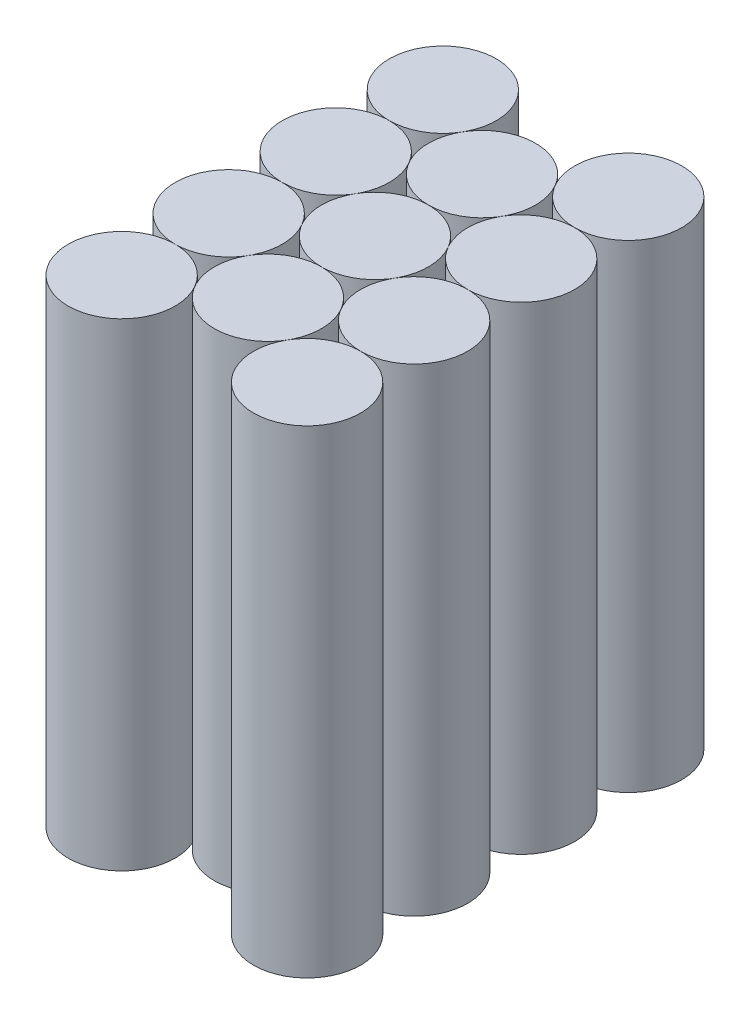
ISO-10303-21;
HEADER;
FILE_DESCRIPTION(('STEP AP214'),'2;1');
FILE_NAME('part.step','',(''),(''),'','','');
FILE_SCHEMA(('AUTOMOTIVE_DESIGN { 1 0 10303 214 1 1 1 1 }'));
ENDSEC;
DATA;
#1=APPLICATION_CONTEXT('core data for automotive mechanical design processes');
#2=APPLICATION_PROTOCOL_DEFINITION('international standard','automotive_design',2000,#1);
#3=PRODUCT_CONTEXT('',#1,'mechanical');
#4=PRODUCT('Part','Part','',(#3));
#5=PRODUCT_RELATED_PRODUCT_CATEGORY('part','',(#4));
#6=PRODUCT_DEFINITION_FORMATION('','',#4);
#7=PRODUCT_DEFINITION_CONTEXT('part definition',#1,'design');
#8=PRODUCT_DEFINITION('design','',#6,#7);
#9=PRODUCT_DEFINITION_SHAPE('','',#8);
#10=(LENGTH_UNIT() NAMED_UNIT(*) SI_UNIT(.MILLI.,.METRE.));
#11=(NAMED_UNIT(*) PLANE_ANGLE_UNIT() SI_UNIT($,.RADIAN.));
#12=(NAMED_UNIT(*) SI_UNIT($,.STERADIAN.) SOLID_ANGLE_UNIT());
#13=UNCERTAINTY_MEASURE_WITH_UNIT(LENGTH_MEASURE(1.E-05),#10,'distance_accuracy_value','');
#14=(GEOMETRIC_REPRESENTATION_CONTEXT(3) GLOBAL_UNCERTAINTY_ASSIGNED_CONTEXT((#13)) GLOBAL_UNIT_ASSIGNED_CONTEXT((#10,
#11,#12)) REPRESENTATION_CONTEXT('',''));
#15=CARTESIAN_POINT('',(0.,0.,0.));
#16=DIRECTION('',(0.,0.,1.));
#17=DIRECTION('',(1.,0.,0.));
#18=AXIS2_PLACEMENT_3D('',#15,#16,#17);
#19=CARTESIAN_POINT('',(12.9903810567666,67.,-22.5));
#20=DIRECTION('',(0.,-1.,0.));
#21=DIRECTION('',(0.,0.,-1.));
#22=AXIS2_PLACEMENT_3D('',#19,#20,#21);
#23=CYLINDRICAL_SURFACE('',#22,7.49999999999999);
#24=CARTESIAN_POINT('',(12.9903810567666,67.,-22.5));
#25=DIRECTION('',(0.,1.,0.));
#26=DIRECTION('',(0.,0.,1.));
#27=AXIS2_PLACEMENT_3D('',#24,#25,#26);
#28=CIRCLE('',#27,7.49999999999999);
#29=CARTESIAN_POINT('',(12.9903810567666,67.,-15.));
#30=VERTEX_POINT('',#29);
#31=EDGE_CURVE('E12',#30,#30,#28,.T.);
#32=ORIENTED_EDGE('',*,*,#31,.F.);
#33=EDGE_LOOP('',(#32));
#34=FACE_BOUND('',#33,.T.);
#35=CARTESIAN_POINT('',(12.9903810567666,0.,-22.5));
#36=DIRECTION('',(0.,1.,0.));
#37=DIRECTION('',(0.,0.,1.));
#38=AXIS2_PLACEMENT_3D('',#35,#36,#37);
#39=CIRCLE('',#38,7.49999999999999);
#40=CARTESIAN_POINT('',(12.9903810567666,0.,-15.));
#41=VERTEX_POINT('',#40);
#42=EDGE_CURVE('E125',#41,#41,#39,.T.);
#43=ORIENTED_EDGE('',*,*,#42,.T.);
#44=EDGE_LOOP('',(#43));
#45=FACE_BOUND('',#44,.T.);
#46=ADVANCED_FACE('F122',(#34,#45),#23,.T.);
#47=CARTESIAN_POINT('',(0.,67.,0.));
#48=DIRECTION('',(0.,1.,0.));
#49=DIRECTION('',(0.,0.,1.));
#50=AXIS2_PLACEMENT_3D('',#47,#48,#49);
#51=PLANE('',#50);
#52=ORIENTED_EDGE('',*,*,#31,.T.);
#53=EDGE_LOOP('',(#52));
#54=FACE_BOUND('',#53,.T.);
#55=ADVANCED_FACE('F137',(#54),#51,.T.);
#56=CARTESIAN_POINT('',(0.,0.,0.));
#57=DIRECTION('',(0.,1.,0.));
#58=DIRECTION('',(0.,0.,1.));
#59=AXIS2_PLACEMENT_3D('',#56,#57,#58);
#60=PLANE('',#59);
#61=ORIENTED_EDGE('',*,*,#42,.F.);
#62=EDGE_LOOP('',(#61));
#63=FACE_BOUND('',#62,.T.);
#64=ADVANCED_FACE('F135',(#63),#60,.F.);
#65=CLOSED_SHELL('',(#46,#55,#64));
#66=MANIFOLD_SOLID_BREP('B2',#65);
#67=CARTESIAN_POINT('',(12.9903810567666,67.,-37.5));
#68=DIRECTION('',(0.,-1.,0.));
#69=DIRECTION('',(0.,0.,-1.));
#70=AXIS2_PLACEMENT_3D('',#67,#68,#69);
#71=CYLINDRICAL_SURFACE('',#70,7.5);
#72=CARTESIAN_POINT('',(12.9903810567666,67.,-37.5));
#73=DIRECTION('',(0.,1.,0.));
#74=DIRECTION('',(0.,0.,1.));
#75=AXIS2_PLACEMENT_3D('',#72,#73,#74);
#76=CIRCLE('',#75,7.5);
#77=CARTESIAN_POINT('',(12.9903810567666,67.,-30.));
#78=VERTEX_POINT('',#77);
#79=EDGE_CURVE('E121',#78,#78,#76,.T.);
#80=ORIENTED_EDGE('',*,*,#79,.F.);
#81=EDGE_LOOP('',(#80));
#82=FACE_BOUND('',#81,.T.);
#83=CARTESIAN_POINT('',(12.9903810567666,0.,-37.5));
#84=DIRECTION('',(0.,1.,0.));
#85=DIRECTION('',(0.,0.,1.));
#86=AXIS2_PLACEMENT_3D('',#83,#84,#85);
#87=CIRCLE('',#86,7.5);
#88=CARTESIAN_POINT('',(12.9903810567666,0.,-30.));
#89=VERTEX_POINT('',#88);
#90=EDGE_CURVE('E174',#89,#89,#87,.T.);
#91=ORIENTED_EDGE('',*,*,#90,.T.);
#92=EDGE_LOOP('',(#91));
#93=FACE_BOUND('',#92,.T.);
#94=ADVANCED_FACE('F171',(#82,#93),#71,.T.);
#95=CARTESIAN_POINT('',(0.,67.,0.));
#96=DIRECTION('',(0.,1.,0.));
#97=DIRECTION('',(0.,0.,1.));
#98=AXIS2_PLACEMENT_3D('',#95,#96,#97);
#99=PLANE('',#98);
#100=ORIENTED_EDGE('',*,*,#79,.T.);
#101=EDGE_LOOP('',(#100));
#102=FACE_BOUND('',#101,.T.);
#103=ADVANCED_FACE('F186',(#102),#99,.T.);
#104=CARTESIAN_POINT('',(0.,0.,0.));
#105=DIRECTION('',(0.,1.,0.));
#106=DIRECTION('',(0.,0.,1.));
#107=AXIS2_PLACEMENT_3D('',#104,#105,#106);
#108=PLANE('',#107);
#109=ORIENTED_EDGE('',*,*,#90,.F.);
#110=EDGE_LOOP('',(#109));
#111=FACE_BOUND('',#110,.T.);
#112=ADVANCED_FACE('F184',(#111),#108,.F.);
#113=CLOSED_SHELL('',(#94,#103,#112));
#114=MANIFOLD_SOLID_BREP('B7',#113);
#115=CARTESIAN_POINT('',(12.9903810567666,67.,-52.5));
#116=DIRECTION('',(0.,-1.,0.));
#117=DIRECTION('',(0.,0.,-1.));
#118=AXIS2_PLACEMENT_3D('',#115,#116,#117);
#119=CYLINDRICAL_SURFACE('',#118,7.49999999999999);
#120=CARTESIAN_POINT('',(12.9903810567666,67.,-52.5));
#121=DIRECTION('',(0.,1.,0.));
#122=DIRECTION('',(0.,0.,1.));
#123=AXIS2_PLACEMENT_3D('',#120,#121,#122);
#124=CIRCLE('',#123,7.49999999999999);
#125=CARTESIAN_POINT('',(12.9903810567666,67.,-45.));
#126=VERTEX_POINT('',#125);
#127=EDGE_CURVE('E170',#126,#126,#124,.T.);
#128=ORIENTED_EDGE('',*,*,#127,.F.);
#129=EDGE_LOOP('',(#128));
#130=FACE_BOUND('',#129,.T.);
#131=CARTESIAN_POINT('',(12.9903810567666,0.,-52.5));
#132=DIRECTION('',(0.,1.,0.));
#133=DIRECTION('',(0.,0.,1.));
#134=AXIS2_PLACEMENT_3D('',#131,#132,#133);
#135=CIRCLE('',#134,7.49999999999999);
#136=CARTESIAN_POINT('',(12.9903810567666,0.,-45.));
#137=VERTEX_POINT('',#136);
#138=EDGE_CURVE('E223',#137,#137,#135,.T.);
#139=ORIENTED_EDGE('',*,*,#138,.T.);
#140=EDGE_LOOP('',(#139));
#141=FACE_BOUND('',#140,.T.);
#142=ADVANCED_FACE('F220',(#130,#141),#119,.T.);
#143=CARTESIAN_POINT('',(0.,67.,0.));
#144=DIRECTION('',(0.,1.,0.));
#145=DIRECTION('',(0.,0.,1.));
#146=AXIS2_PLACEMENT_3D('',#143,#144,#145);
#147=PLANE('',#146);
#148=ORIENTED_EDGE('',*,*,#127,.T.);
#149=EDGE_LOOP('',(#148));
#150=FACE_BOUND('',#149,.T.);
#151=ADVANCED_FACE('F235',(#150),#147,.T.);
#152=CARTESIAN_POINT('',(0.,0.,0.));
#153=DIRECTION('',(0.,1.,0.));
#154=DIRECTION('',(0.,0.,1.));
#155=AXIS2_PLACEMENT_3D('',#152,#153,#154);
#156=PLANE('',#155);
#157=ORIENTED_EDGE('',*,*,#138,.F.);
#158=EDGE_LOOP('',(#157));
#159=FACE_BOUND('',#158,.T.);
#160=ADVANCED_FACE('F233',(#159),#156,.F.);
#161=CLOSED_SHELL('',(#142,#151,#160));
#162=MANIFOLD_SOLID_BREP('B116',#161);
#163=CARTESIAN_POINT('',(0.,67.,-30.));
#164=DIRECTION('',(0.,-1.,0.));
#165=DIRECTION('',(0.,0.,-1.));
#166=AXIS2_PLACEMENT_3D('',#163,#164,#165);
#167=CYLINDRICAL_SURFACE('',#166,7.5);
#168=CARTESIAN_POINT('',(0.,67.,-30.));
#169=DIRECTION('',(0.,1.,0.));
#170=DIRECTION('',(0.,0.,1.));
#171=AXIS2_PLACEMENT_3D('',#168,#169,#170);
#172=CIRCLE('',#171,7.5);
#173=CARTESIAN_POINT('',(0.,67.,-22.5));
#174=VERTEX_POINT('',#173);
#175=EDGE_CURVE('E219',#174,#174,#172,.T.);
#176=ORIENTED_EDGE('',*,*,#175,.F.);
#177=EDGE_LOOP('',(#176));
#178=FACE_BOUND('',#177,.T.);
#179=CARTESIAN_POINT('',(0.,0.,-30.));
#180=DIRECTION('',(0.,1.,0.));
#181=DIRECTION('',(0.,0.,1.));
#182=AXIS2_PLACEMENT_3D('',#179,#180,#181);
#183=CIRCLE('',#182,7.5);
#184=CARTESIAN_POINT('',(0.,0.,-22.5));
#185=VERTEX_POINT('',#184);
#186=EDGE_CURVE('E272',#185,#185,#183,.T.);
#187=ORIENTED_EDGE('',*,*,#186,.T.);
#188=EDGE_LOOP('',(#187));
#189=FACE_BOUND('',#188,.T.);
#190=ADVANCED_FACE('F269',(#178,#189),#167,.T.);
#191=CARTESIAN_POINT('',(0.,67.,0.));
#192=DIRECTION('',(0.,1.,0.));
#193=DIRECTION('',(0.,0.,1.));
#194=AXIS2_PLACEMENT_3D('',#191,#192,#193);
#195=PLANE('',#194);
#196=ORIENTED_EDGE('',*,*,#175,.T.);
#197=EDGE_LOOP('',(#196));
#198=FACE_BOUND('',#197,.T.);
#199=ADVANCED_FACE('F284',(#198),#195,.T.);
#200=CARTESIAN_POINT('',(0.,0.,0.));
#201=DIRECTION('',(0.,1.,0.));
#202=DIRECTION('',(0.,0.,1.));
#203=AXIS2_PLACEMENT_3D('',#200,#201,#202);
#204=PLANE('',#203);
#205=ORIENTED_EDGE('',*,*,#186,.F.);
#206=EDGE_LOOP('',(#205));
#207=FACE_BOUND('',#206,.T.);
#208=ADVANCED_FACE('F282',(#207),#204,.F.);
#209=CLOSED_SHELL('',(#190,#199,#208));
#210=MANIFOLD_SOLID_BREP('B165',#209);
#211=CARTESIAN_POINT('',(0.,67.,-45.));
#212=DIRECTION('',(0.,-1.,0.));
#213=DIRECTION('',(0.,0.,-1.));
#214=AXIS2_PLACEMENT_3D('',#211,#212,#213);
#215=CYLINDRICAL_SURFACE('',#214,7.5);
#216=CARTESIAN_POINT('',(0.,67.,-45.));
#217=DIRECTION('',(0.,1.,0.));
#218=DIRECTION('',(0.,0.,1.));
#219=AXIS2_PLACEMENT_3D('',#216,#217,#218);
#220=CIRCLE('',#219,7.5);
#221=CARTESIAN_POINT('',(0.,67.,-37.5));
#222=VERTEX_POINT('',#221);
#223=EDGE_CURVE('E268',#222,#222,#220,.T.);
#224=ORIENTED_EDGE('',*,*,#223,.F.);
#225=EDGE_LOOP('',(#224));
#226=FACE_BOUND('',#225,.T.);
#227=CARTESIAN_POINT('',(0.,0.,-45.));
#228=DIRECTION('',(0.,1.,0.));
#229=DIRECTION('',(0.,0.,1.));
#230=AXIS2_PLACEMENT_3D('',#227,#228,#229);
#231=CIRCLE('',#230,7.5);
#232=CARTESIAN_POINT('',(0.,0.,-37.5));
#233=VERTEX_POINT('',#232);
#234=EDGE_CURVE('E321',#233,#233,#231,.T.);
#235=ORIENTED_EDGE('',*,*,#234,.T.);
#236=EDGE_LOOP('',(#235));
#237=FACE_BOUND('',#236,.T.);
#238=ADVANCED_FACE('F318',(#226,#237),#215,.T.);
#239=CARTESIAN_POINT('',(0.,67.,0.));
#240=DIRECTION('',(0.,1.,0.));
#241=DIRECTION('',(0.,0.,1.));
#242=AXIS2_PLACEMENT_3D('',#239,#240,#241);
#243=PLANE('',#242);
#244=ORIENTED_EDGE('',*,*,#223,.T.);
#245=EDGE_LOOP('',(#244));
#246=FACE_BOUND('',#245,.T.);
#247=ADVANCED_FACE('F333',(#246),#243,.T.);
#248=CARTESIAN_POINT('',(0.,0.,0.));
#249=DIRECTION('',(0.,1.,0.));
#250=DIRECTION('',(0.,0.,1.));
#251=AXIS2_PLACEMENT_3D('',#248,#249,#250);
#252=PLANE('',#251);
#253=ORIENTED_EDGE('',*,*,#234,.F.);
#254=EDGE_LOOP('',(#253));
#255=FACE_BOUND('',#254,.T.);
#256=ADVANCED_FACE('F331',(#255),#252,.F.);
#257=CLOSED_SHELL('',(#238,#247,#256));
#258=MANIFOLD_SOLID_BREP('B214',#257);
#259=CARTESIAN_POINT('',(-12.9903810567666,67.,-52.5));
#260=DIRECTION('',(0.,-1.,0.));
#261=DIRECTION('',(0.,0.,-1.));
#262=AXIS2_PLACEMENT_3D('',#259,#260,#261);
#263=CYLINDRICAL_SURFACE('',#262,7.49999999999999);
#264=CARTESIAN_POINT('',(-12.9903810567666,67.,-52.5));
#265=DIRECTION('',(0.,1.,0.));
#266=DIRECTION('',(0.,0.,1.));
#267=AXIS2_PLACEMENT_3D('',#264,#265,#266);
#268=CIRCLE('',#267,7.49999999999999);
#269=CARTESIAN_POINT('',(-12.9903810567666,67.,-45.));
#270=VERTEX_POINT('',#269);
#271=EDGE_CURVE('E317',#270,#270,#268,.T.);
#272=ORIENTED_EDGE('',*,*,#271,.F.);
#273=EDGE_LOOP('',(#272));
#274=FACE_BOUND('',#273,.T.);
#275=CARTESIAN_POINT('',(-12.9903810567666,0.,-52.5));
#276=DIRECTION('',(0.,1.,0.));
#277=DIRECTION('',(0.,0.,1.));
#278=AXIS2_PLACEMENT_3D('',#275,#276,#277);
#279=CIRCLE('',#278,7.49999999999999);
#280=CARTESIAN_POINT('',(-12.9903810567666,0.,-45.));
#281=VERTEX_POINT('',#280);
#282=EDGE_CURVE('E370',#281,#281,#279,.T.);
#283=ORIENTED_EDGE('',*,*,#282,.T.);
#284=EDGE_LOOP('',(#283));
#285=FACE_BOUND('',#284,.T.);
#286=ADVANCED_FACE('F367',(#274,#285),#263,.T.);
#287=CARTESIAN_POINT('',(0.,67.,0.));
#288=DIRECTION('',(0.,1.,0.));
#289=DIRECTION('',(0.,0.,1.));
#290=AXIS2_PLACEMENT_3D('',#287,#288,#289);
#291=PLANE('',#290);
#292=ORIENTED_EDGE('',*,*,#271,.T.);
#293=EDGE_LOOP('',(#292));
#294=FACE_BOUND('',#293,.T.);
#295=ADVANCED_FACE('F382',(#294),#291,.T.);
#296=CARTESIAN_POINT('',(0.,0.,0.));
#297=DIRECTION('',(0.,1.,0.));
#298=DIRECTION('',(0.,0.,1.));
#299=AXIS2_PLACEMENT_3D('',#296,#297,#298);
#300=PLANE('',#299);
#301=ORIENTED_EDGE('',*,*,#282,.F.);
#302=EDGE_LOOP('',(#301));
#303=FACE_BOUND('',#302,.T.);
#304=ADVANCED_FACE('F380',(#303),#300,.F.);
#305=CLOSED_SHELL('',(#286,#295,#304));
#306=MANIFOLD_SOLID_BREP('B263',#305);
#307=CARTESIAN_POINT('',(-12.9903810567666,67.,-37.5));
#308=DIRECTION('',(0.,-1.,0.));
#309=DIRECTION('',(0.,0.,-1.));
#310=AXIS2_PLACEMENT_3D('',#307,#308,#309);
#311=CYLINDRICAL_SURFACE('',#310,7.5);
#312=CARTESIAN_POINT('',(-12.9903810567666,67.,-37.5));
#313=DIRECTION('',(0.,1.,0.));
#314=DIRECTION('',(0.,0.,1.));
#315=AXIS2_PLACEMENT_3D('',#312,#313,#314);
#316=CIRCLE('',#315,7.5);
#317=CARTESIAN_POINT('',(-12.9903810567666,67.,-30.));
#318=VERTEX_POINT('',#317);
#319=EDGE_CURVE('E366',#318,#318,#316,.T.);
#320=ORIENTED_EDGE('',*,*,#319,.F.);
#321=EDGE_LOOP('',(#320));
#322=FACE_BOUND('',#321,.T.);
#323=CARTESIAN_POINT('',(-12.9903810567666,0.,-37.5));
#324=DIRECTION('',(0.,1.,0.));
#325=DIRECTION('',(0.,0.,1.));
#326=AXIS2_PLACEMENT_3D('',#323,#324,#325);
#327=CIRCLE('',#326,7.5);
#328=CARTESIAN_POINT('',(-12.9903810567666,0.,-30.));
#329=VERTEX_POINT('',#328);
#330=EDGE_CURVE('E419',#329,#329,#327,.T.);
#331=ORIENTED_EDGE('',*,*,#330,.T.);
#332=EDGE_LOOP('',(#331));
#333=FACE_BOUND('',#332,.T.);
#334=ADVANCED_FACE('F416',(#322,#333),#311,.T.);
#335=CARTESIAN_POINT('',(0.,67.,0.));
#336=DIRECTION('',(0.,1.,0.));
#337=DIRECTION('',(0.,0.,1.));
#338=AXIS2_PLACEMENT_3D('',#335,#336,#337);
#339=PLANE('',#338);
#340=ORIENTED_EDGE('',*,*,#319,.T.);
#341=EDGE_LOOP('',(#340));
#342=FACE_BOUND('',#341,.T.);
#343=ADVANCED_FACE('F431',(#342),#339,.T.);
#344=CARTESIAN_POINT('',(0.,0.,0.));
#345=DIRECTION('',(0.,1.,0.));
#346=DIRECTION('',(0.,0.,1.));
#347=AXIS2_PLACEMENT_3D('',#344,#345,#346);
#348=PLANE('',#347);
#349=ORIENTED_EDGE('',*,*,#330,.F.);
#350=EDGE_LOOP('',(#349));
#351=FACE_BOUND('',#350,.T.);
#352=ADVANCED_FACE('F429',(#351),#348,.F.);
#353=CLOSED_SHELL('',(#334,#343,#352));
#354=MANIFOLD_SOLID_BREP('B312',#353);
#355=CARTESIAN_POINT('',(-12.9903810567666,67.,-22.5));
#356=DIRECTION('',(0.,-1.,0.));
#357=DIRECTION('',(0.,0.,-1.));
#358=AXIS2_PLACEMENT_3D('',#355,#356,#357);
#359=CYLINDRICAL_SURFACE('',#358,7.5);
#360=CARTESIAN_POINT('',(-12.9903810567666,67.,-22.5));
#361=DIRECTION('',(0.,1.,0.));
#362=DIRECTION('',(0.,0.,1.));
#363=AXIS2_PLACEMENT_3D('',#360,#361,#362);
#364=CIRCLE('',#363,7.5);
#365=CARTESIAN_POINT('',(-12.9903810567666,67.,-15.));
#366=VERTEX_POINT('',#365);
#367=EDGE_CURVE('E415',#366,#366,#364,.T.);
#368=ORIENTED_EDGE('',*,*,#367,.F.);
#369=EDGE_LOOP('',(#368));
#370=FACE_BOUND('',#369,.T.);
#371=CARTESIAN_POINT('',(-12.9903810567666,0.,-22.5));
#372=DIRECTION('',(0.,1.,0.));
#373=DIRECTION('',(0.,0.,1.));
#374=AXIS2_PLACEMENT_3D('',#371,#372,#373);
#375=CIRCLE('',#374,7.5);
#376=CARTESIAN_POINT('',(-12.9903810567666,0.,-15.));
#377=VERTEX_POINT('',#376);
#378=EDGE_CURVE('E468',#377,#377,#375,.T.);
#379=ORIENTED_EDGE('',*,*,#378,.T.);
#380=EDGE_LOOP('',(#379));
#381=FACE_BOUND('',#380,.T.);
#382=ADVANCED_FACE('F465',(#370,#381),#359,.T.);
#383=CARTESIAN_POINT('',(0.,67.,0.));
#384=DIRECTION('',(0.,1.,0.));
#385=DIRECTION('',(0.,0.,1.));
#386=AXIS2_PLACEMENT_3D('',#383,#384,#385);
#387=PLANE('',#386);
#388=ORIENTED_EDGE('',*,*,#367,.T.);
#389=EDGE_LOOP('',(#388));
#390=FACE_BOUND('',#389,.T.);
#391=ADVANCED_FACE('F480',(#390),#387,.T.);
#392=CARTESIAN_POINT('',(0.,0.,0.));
#393=DIRECTION('',(0.,1.,0.));
#394=DIRECTION('',(0.,0.,1.));
#395=AXIS2_PLACEMENT_3D('',#392,#393,#394);
#396=PLANE('',#395);
#397=ORIENTED_EDGE('',*,*,#378,.F.);
#398=EDGE_LOOP('',(#397));
#399=FACE_BOUND('',#398,.T.);
#400=ADVANCED_FACE('F478',(#399),#396,.F.);
#401=CLOSED_SHELL('',(#382,#391,#400));
#402=MANIFOLD_SOLID_BREP('B361',#401);
#403=CARTESIAN_POINT('',(-12.9903810567666,67.,-7.5));
#404=DIRECTION('',(0.,-1.,0.));
#405=DIRECTION('',(0.,0.,-1.));
#406=AXIS2_PLACEMENT_3D('',#403,#404,#405);
#407=CYLINDRICAL_SURFACE('',#406,7.5);
#408=CARTESIAN_POINT('',(-12.9903810567666,67.,-7.5));
#409=DIRECTION('',(0.,1.,0.));
#410=DIRECTION('',(0.,0.,1.));
#411=AXIS2_PLACEMENT_3D('',#408,#409,#410);
#412=CIRCLE('',#411,7.5);
#413=CARTESIAN_POINT('',(-12.9903810567666,67.,0.));
#414=VERTEX_POINT('',#413);
#415=EDGE_CURVE('E464',#414,#414,#412,.T.);
#416=ORIENTED_EDGE('',*,*,#415,.F.);
#417=EDGE_LOOP('',(#416));
#418=FACE_BOUND('',#417,.T.);
#419=CARTESIAN_POINT('',(-12.9903810567666,0.,-7.5));
#420=DIRECTION('',(0.,1.,0.));
#421=DIRECTION('',(0.,0.,1.));
#422=AXIS2_PLACEMENT_3D('',#419,#420,#421);
#423=CIRCLE('',#422,7.5);
#424=CARTESIAN_POINT('',(-12.9903810567666,0.,0.));
#425=VERTEX_POINT('',#424);
#426=EDGE_CURVE('E517',#425,#425,#423,.T.);
#427=ORIENTED_EDGE('',*,*,#426,.T.);
#428=EDGE_LOOP('',(#427));
#429=FACE_BOUND('',#428,.T.);
#430=ADVANCED_FACE('F514',(#418,#429),#407,.T.);
#431=CARTESIAN_POINT('',(0.,67.,0.));
#432=DIRECTION('',(0.,1.,0.));
#433=DIRECTION('',(0.,0.,1.));
#434=AXIS2_PLACEMENT_3D('',#431,#432,#433);
#435=PLANE('',#434);
#436=ORIENTED_EDGE('',*,*,#415,.T.);
#437=EDGE_LOOP('',(#436));
#438=FACE_BOUND('',#437,.T.);
#439=ADVANCED_FACE('F529',(#438),#435,.T.);
#440=CARTESIAN_POINT('',(0.,0.,0.));
#441=DIRECTION('',(0.,1.,0.));
#442=DIRECTION('',(0.,0.,1.));
#443=AXIS2_PLACEMENT_3D('',#440,#441,#442);
#444=PLANE('',#443);
#445=ORIENTED_EDGE('',*,*,#426,.F.);
#446=EDGE_LOOP('',(#445));
#447=FACE_BOUND('',#446,.T.);
#448=ADVANCED_FACE('F527',(#447),#444,.F.);
#449=CLOSED_SHELL('',(#430,#439,#448));
#450=MANIFOLD_SOLID_BREP('B410',#449);
#451=CARTESIAN_POINT('',(0.,67.,-15.));
#452=DIRECTION('',(0.,-1.,0.));
#453=DIRECTION('',(0.,0.,-1.));
#454=AXIS2_PLACEMENT_3D('',#451,#452,#453);
#455=CYLINDRICAL_SURFACE('',#454,7.5);
#456=CARTESIAN_POINT('',(0.,67.,-15.));
#457=DIRECTION('',(0.,1.,0.));
#458=DIRECTION('',(0.,0.,1.));
#459=AXIS2_PLACEMENT_3D('',#456,#457,#458);
#460=CIRCLE('',#459,7.5);
#461=CARTESIAN_POINT('',(0.,67.,-7.5));
#462=VERTEX_POINT('',#461);
#463=EDGE_CURVE('E513',#462,#462,#460,.T.);
#464=ORIENTED_EDGE('',*,*,#463,.F.);
#465=EDGE_LOOP('',(#464));
#466=FACE_BOUND('',#465,.T.);
#467=CARTESIAN_POINT('',(0.,0.,-15.));
#468=DIRECTION('',(0.,1.,0.));
#469=DIRECTION('',(0.,0.,1.));
#470=AXIS2_PLACEMENT_3D('',#467,#468,#469);
#471=CIRCLE('',#470,7.5);
#472=CARTESIAN_POINT('',(0.,0.,-7.5));
#473=VERTEX_POINT('',#472);
#474=EDGE_CURVE('E565',#473,#473,#471,.T.);
#475=ORIENTED_EDGE('',*,*,#474,.T.);
#476=EDGE_LOOP('',(#475));
#477=FACE_BOUND('',#476,.T.);
#478=ADVANCED_FACE('F562',(#466,#477),#455,.T.);
#479=CARTESIAN_POINT('',(0.,67.,0.));
#480=DIRECTION('',(0.,1.,0.));
#481=DIRECTION('',(0.,0.,1.));
#482=AXIS2_PLACEMENT_3D('',#479,#480,#481);
#483=PLANE('',#482);
#484=ORIENTED_EDGE('',*,*,#463,.T.);
#485=EDGE_LOOP('',(#484));
#486=FACE_BOUND('',#485,.T.);
#487=ADVANCED_FACE('F577',(#486),#483,.T.);
#488=CARTESIAN_POINT('',(0.,0.,0.));
#489=DIRECTION('',(0.,1.,0.));
#490=DIRECTION('',(0.,0.,1.));
#491=AXIS2_PLACEMENT_3D('',#488,#489,#490);
#492=PLANE('',#491);
#493=ORIENTED_EDGE('',*,*,#474,.F.);
#494=EDGE_LOOP('',(#493));
#495=FACE_BOUND('',#494,.T.);
#496=ADVANCED_FACE('F575',(#495),#492,.F.);
#497=CLOSED_SHELL('',(#478,#487,#496));
#498=MANIFOLD_SOLID_BREP('B459',#497);
#499=CARTESIAN_POINT('',(12.9903810567666,67.,-7.5));
#500=DIRECTION('',(0.,-1.,0.));
#501=DIRECTION('',(0.,0.,-1.));
#502=AXIS2_PLACEMENT_3D('',#499,#500,#501);
#503=CYLINDRICAL_SURFACE('',#502,7.49999999999999);
#504=CARTESIAN_POINT('',(12.9903810567666,67.,-7.5));
#505=DIRECTION('',(0.,1.,0.));
#506=DIRECTION('',(0.,0.,1.));
#507=AXIS2_PLACEMENT_3D('',#504,#505,#506);
#508=CIRCLE('',#507,7.49999999999999);
#509=CARTESIAN_POINT('',(12.9903810567666,67.,0.));
#510=VERTEX_POINT('',#509);
#511=EDGE_CURVE('E561',#510,#510,#508,.T.);
#512=ORIENTED_EDGE('',*,*,#511,.F.);
#513=EDGE_LOOP('',(#512));
#514=FACE_BOUND('',#513,.T.);
#515=CARTESIAN_POINT('',(12.9903810567666,0.,-7.5));
#516=DIRECTION('',(0.,1.,0.));
#517=DIRECTION('',(0.,0.,1.));
#518=AXIS2_PLACEMENT_3D('',#515,#516,#517);
#519=CIRCLE('',#518,7.49999999999999);
#520=CARTESIAN_POINT('',(12.9903810567666,0.,0.));
#521=VERTEX_POINT('',#520);
#522=EDGE_CURVE('E606',#521,#521,#519,.T.);
#523=ORIENTED_EDGE('',*,*,#522,.T.);
#524=EDGE_LOOP('',(#523));
#525=FACE_BOUND('',#524,.T.);
#526=ADVANCED_FACE('F603',(#514,#525),#503,.T.);
#527=CARTESIAN_POINT('',(0.,67.,0.));
#528=DIRECTION('',(0.,1.,0.));
#529=DIRECTION('',(0.,0.,1.));
#530=AXIS2_PLACEMENT_3D('',#527,#528,#529);
#531=PLANE('',#530);
#532=ORIENTED_EDGE('',*,*,#511,.T.);
#533=EDGE_LOOP('',(#532));
#534=FACE_BOUND('',#533,.T.);
#535=ADVANCED_FACE('F618',(#534),#531,.T.);
#536=CARTESIAN_POINT('',(0.,0.,0.));
#537=DIRECTION('',(0.,1.,0.));
#538=DIRECTION('',(0.,0.,1.));
#539=AXIS2_PLACEMENT_3D('',#536,#537,#538);
#540=PLANE('',#539);
#541=ORIENTED_EDGE('',*,*,#522,.F.);
#542=EDGE_LOOP('',(#541));
#543=FACE_BOUND('',#542,.T.);
#544=ADVANCED_FACE('F616',(#543),#540,.F.);
#545=CLOSED_SHELL('',(#526,#535,#544));
#546=MANIFOLD_SOLID_BREP('B508',#545);
#547=ADVANCED_BREP_SHAPE_REPRESENTATION('',(#18,#66,#114,#162,#210,#258,#306,#354,#402,#450,
#498,#546),#14);
#548=SHAPE_DEFINITION_REPRESENTATION(#9,#547);
ENDSEC;
END-ISO-10303-21;
